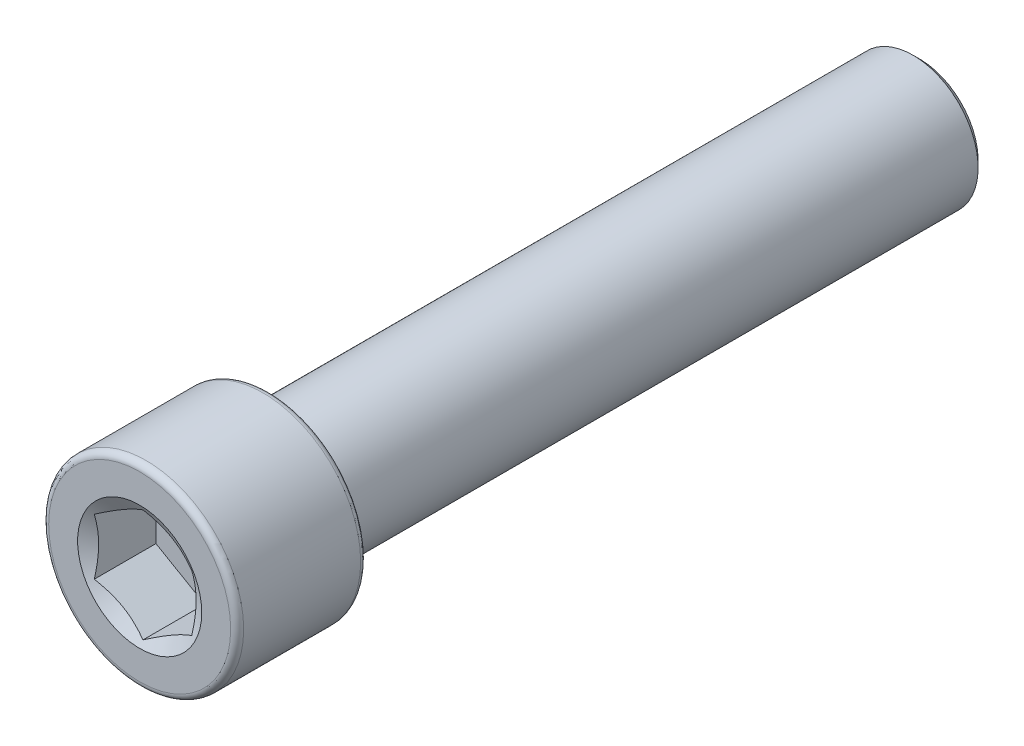
ISO-10303-21;
HEADER;
FILE_DESCRIPTION(('STEP AP214'),'2;1');
FILE_NAME('part.step','',(''),(''),'','','');
FILE_SCHEMA(('AUTOMOTIVE_DESIGN { 1 0 10303 214 1 1 1 1 }'));
ENDSEC;
DATA;
#1=APPLICATION_CONTEXT('core data for automotive mechanical design processes');
#2=APPLICATION_PROTOCOL_DEFINITION('international standard','automotive_design',2000,#1);
#3=PRODUCT_CONTEXT('',#1,'mechanical');
#4=PRODUCT('Part','Part','',(#3));
#5=PRODUCT_RELATED_PRODUCT_CATEGORY('part','',(#4));
#6=PRODUCT_DEFINITION_FORMATION('','',#4);
#7=PRODUCT_DEFINITION_CONTEXT('part definition',#1,'design');
#8=PRODUCT_DEFINITION('design','',#6,#7);
#9=PRODUCT_DEFINITION_SHAPE('','',#8);
#10=(LENGTH_UNIT() NAMED_UNIT(*) SI_UNIT(.MILLI.,.METRE.));
#11=(NAMED_UNIT(*) PLANE_ANGLE_UNIT() SI_UNIT($,.RADIAN.));
#12=(NAMED_UNIT(*) SI_UNIT($,.STERADIAN.) SOLID_ANGLE_UNIT());
#13=UNCERTAINTY_MEASURE_WITH_UNIT(LENGTH_MEASURE(1.E-05),#10,'distance_accuracy_value','');
#14=(GEOMETRIC_REPRESENTATION_CONTEXT(3) GLOBAL_UNCERTAINTY_ASSIGNED_CONTEXT((#13)) GLOBAL_UNIT_ASSIGNED_CONTEXT((#10,
#11,#12)) REPRESENTATION_CONTEXT('',''));
#15=CARTESIAN_POINT('',(0.,0.,0.));
#16=DIRECTION('',(0.,0.,1.));
#17=DIRECTION('',(1.,0.,0.));
#18=AXIS2_PLACEMENT_3D('',#15,#16,#17);
#19=CARTESIAN_POINT('',(0.,0.,-19.05));
#20=DIRECTION('',(0.,0.,-1.));
#21=DIRECTION('',(-1.,0.,0.));
#22=AXIS2_PLACEMENT_3D('',#19,#20,#21);
#23=PLANE('',#22);
#24=CARTESIAN_POINT('',(0.,0.,-19.05));
#25=DIRECTION('',(0.,0.,-1.));
#26=DIRECTION('',(-1.,0.,0.));
#27=AXIS2_PLACEMENT_3D('',#24,#25,#26);
#28=CIRCLE('',#27,2.85750000000001);
#29=CARTESIAN_POINT('',(-2.85750000000001,0.,-19.05));
#30=VERTEX_POINT('',#29);
#31=EDGE_CURVE('E49',#30,#30,#28,.T.);
#32=ORIENTED_EDGE('',*,*,#31,.T.);
#33=EDGE_LOOP('',(#32));
#34=FACE_BOUND('',#33,.T.);
#35=ADVANCED_FACE('F36',(#34),#23,.T.);
#36=CARTESIAN_POINT('',(0.,0.,-19.05));
#37=DIRECTION('',(0.,0.,1.));
#38=DIRECTION('',(1.,0.,0.));
#39=AXIS2_PLACEMENT_3D('',#36,#37,#38);
#40=CONICAL_SURFACE('',#39,2.85750000000001,0.785398163397451);
#41=CARTESIAN_POINT('',(0.,0.,-18.7325));
#42=DIRECTION('',(0.,0.,-1.));
#43=DIRECTION('',(-1.,0.,0.));
#44=AXIS2_PLACEMENT_3D('',#41,#42,#43);
#45=CIRCLE('',#44,3.17500000000001);
#46=CARTESIAN_POINT('',(-3.17500000000001,0.,-18.7325));
#47=VERTEX_POINT('',#46);
#48=EDGE_CURVE('E134',#47,#47,#45,.T.);
#49=ORIENTED_EDGE('',*,*,#48,.T.);
#50=EDGE_LOOP('',(#49));
#51=FACE_BOUND('',#50,.T.);
#52=ORIENTED_EDGE('',*,*,#31,.F.);
#53=EDGE_LOOP('',(#52));
#54=FACE_BOUND('',#53,.T.);
#55=ADVANCED_FACE('F140',(#51,#54),#40,.T.);
#56=CARTESIAN_POINT('',(0.,0.,-19.05));
#57=DIRECTION('',(0.,0.,-1.));
#58=DIRECTION('',(-1.,0.,0.));
#59=AXIS2_PLACEMENT_3D('',#56,#57,#58);
#60=CYLINDRICAL_SURFACE('',#59,3.17500000000001);
#61=CARTESIAN_POINT('',(0.,0.,12.7));
#62=DIRECTION('',(0.,0.,-1.));
#63=DIRECTION('',(-1.,0.,0.));
#64=AXIS2_PLACEMENT_3D('',#61,#62,#63);
#65=CIRCLE('',#64,3.175);
#66=CARTESIAN_POINT('',(-3.175,0.,12.7));
#67=VERTEX_POINT('',#66);
#68=EDGE_CURVE('E131',#67,#67,#65,.T.);
#69=ORIENTED_EDGE('',*,*,#68,.T.);
#70=EDGE_LOOP('',(#69));
#71=FACE_BOUND('',#70,.T.);
#72=ORIENTED_EDGE('',*,*,#48,.F.);
#73=EDGE_LOOP('',(#72));
#74=FACE_BOUND('',#73,.T.);
#75=ADVANCED_FACE('F142',(#71,#74),#60,.T.);
#76=CARTESIAN_POINT('',(0.,3.175,12.7));
#77=DIRECTION('',(0.,0.,-1.));
#78=DIRECTION('',(-1.,0.,0.));
#79=AXIS2_PLACEMENT_3D('',#76,#77,#78);
#80=PLANE('',#79);
#81=CARTESIAN_POINT('',(0.,0.,12.7));
#82=DIRECTION('',(0.,0.,-1.));
#83=DIRECTION('',(-1.,0.,0.));
#84=AXIS2_PLACEMENT_3D('',#81,#82,#83);
#85=CIRCLE('',#84,4.445);
#86=CARTESIAN_POINT('',(-4.445,0.,12.7));
#87=VERTEX_POINT('',#86);
#88=EDGE_CURVE('E128',#87,#87,#85,.T.);
#89=ORIENTED_EDGE('',*,*,#88,.T.);
#90=EDGE_LOOP('',(#89));
#91=FACE_BOUND('',#90,.T.);
#92=ORIENTED_EDGE('',*,*,#68,.F.);
#93=EDGE_LOOP('',(#92));
#94=FACE_BOUND('',#93,.T.);
#95=ADVANCED_FACE('F148',(#91,#94),#80,.T.);
#96=CARTESIAN_POINT('',(0.,0.,13.0175));
#97=DIRECTION('',(0.,0.,-1.));
#98=DIRECTION('',(-1.,0.,0.));
#99=AXIS2_PLACEMENT_3D('',#96,#97,#98);
#100=TOROIDAL_SURFACE('',#99,4.445,0.3175);
#101=CARTESIAN_POINT('',(0.,0.,13.0175));
#102=DIRECTION('',(0.,0.,-1.));
#103=DIRECTION('',(-1.,0.,0.));
#104=AXIS2_PLACEMENT_3D('',#101,#102,#103);
#105=CIRCLE('',#104,4.7625);
#106=CARTESIAN_POINT('',(-4.7625,0.,13.0175));
#107=VERTEX_POINT('',#106);
#108=EDGE_CURVE('E125',#107,#107,#105,.T.);
#109=ORIENTED_EDGE('',*,*,#108,.T.);
#110=EDGE_LOOP('',(#109));
#111=FACE_BOUND('',#110,.T.);
#112=ORIENTED_EDGE('',*,*,#88,.F.);
#113=EDGE_LOOP('',(#112));
#114=FACE_BOUND('',#113,.T.);
#115=ADVANCED_FACE('F154',(#111,#114),#100,.T.);
#116=CARTESIAN_POINT('',(0.,0.,-19.05));
#117=DIRECTION('',(0.,0.,-1.));
#118=DIRECTION('',(-1.,0.,0.));
#119=AXIS2_PLACEMENT_3D('',#116,#117,#118);
#120=CYLINDRICAL_SURFACE('',#119,4.7625);
#121=CARTESIAN_POINT('',(0.,0.,18.7325));
#122=DIRECTION('',(0.,0.,-1.));
#123=DIRECTION('',(-1.,0.,0.));
#124=AXIS2_PLACEMENT_3D('',#121,#122,#123);
#125=CIRCLE('',#124,4.7625);
#126=CARTESIAN_POINT('',(-4.7625,0.,18.7325));
#127=VERTEX_POINT('',#126);
#128=EDGE_CURVE('E122',#127,#127,#125,.T.);
#129=ORIENTED_EDGE('',*,*,#128,.T.);
#130=EDGE_LOOP('',(#129));
#131=FACE_BOUND('',#130,.T.);
#132=ORIENTED_EDGE('',*,*,#108,.F.);
#133=EDGE_LOOP('',(#132));
#134=FACE_BOUND('',#133,.T.);
#135=ADVANCED_FACE('F158',(#131,#134),#120,.T.);
#136=CARTESIAN_POINT('',(0.,0.,18.7325));
#137=DIRECTION('',(0.,0.,-1.));
#138=DIRECTION('',(-1.,0.,0.));
#139=AXIS2_PLACEMENT_3D('',#136,#137,#138);
#140=TOROIDAL_SURFACE('',#139,4.445,0.317499999999998);
#141=CARTESIAN_POINT('',(0.,0.,19.05));
#142=DIRECTION('',(0.,0.,-1.));
#143=DIRECTION('',(-1.,0.,0.));
#144=AXIS2_PLACEMENT_3D('',#141,#142,#143);
#145=CIRCLE('',#144,4.445);
#146=CARTESIAN_POINT('',(-4.445,0.,19.05));
#147=VERTEX_POINT('',#146);
#148=EDGE_CURVE('E119',#147,#147,#145,.T.);
#149=ORIENTED_EDGE('',*,*,#148,.T.);
#150=EDGE_LOOP('',(#149));
#151=FACE_BOUND('',#150,.T.);
#152=ORIENTED_EDGE('',*,*,#128,.F.);
#153=EDGE_LOOP('',(#152));
#154=FACE_BOUND('',#153,.T.);
#155=ADVANCED_FACE('F162',(#151,#154),#140,.T.);
#156=CARTESIAN_POINT('',(0.,4.44499999999999,19.05));
#157=DIRECTION('',(0.,0.,1.));
#158=DIRECTION('',(1.,0.,0.));
#159=AXIS2_PLACEMENT_3D('',#156,#157,#158);
#160=PLANE('',#159);
#161=CARTESIAN_POINT('',(0.,0.,19.05));
#162=DIRECTION('',(0.,0.,1.));
#163=DIRECTION('',(1.,0.,0.));
#164=AXIS2_PLACEMENT_3D('',#161,#162,#163);
#165=CIRCLE('',#164,3.03219221417966);
#166=CARTESIAN_POINT('',(3.03219221417966,0.,19.05));
#167=VERTEX_POINT('',#166);
#168=EDGE_CURVE('E256',#167,#167,#165,.T.);
#169=ORIENTED_EDGE('',*,*,#168,.F.);
#170=EDGE_LOOP('',(#169));
#171=FACE_BOUND('',#170,.T.);
#172=ORIENTED_EDGE('',*,*,#148,.F.);
#173=EDGE_LOOP('',(#172));
#174=FACE_BOUND('',#173,.T.);
#175=ADVANCED_FACE('F166',(#171,#174),#160,.T.);
#176=CARTESIAN_POINT('',(0.,0.,19.05));
#177=DIRECTION('',(0.,0.,1.));
#178=DIRECTION('',(1.,0.,0.));
#179=AXIS2_PLACEMENT_3D('',#176,#177,#178);
#180=CONICAL_SURFACE('',#179,3.03219221417966,1.0471975511966);
#181=ORIENTED_EDGE('',*,*,#168,.T.);
#182=EDGE_LOOP('',(#181));
#183=FACE_BOUND('',#182,.T.);
#184=CARTESIAN_POINT('',(2.38145,1.37469985845396,18.8869296797747));
#185=CARTESIAN_POINT('',(2.27680510857802,1.43511661468575,18.8520335875339));
#186=CARTESIAN_POINT('',(2.1712569313955,1.49605488319456,18.8202965816836));
#187=CARTESIAN_POINT('',(1.95833280582789,1.61898668440798,18.7648986717318));
#188=CARTESIAN_POINT('',(1.85095307338658,1.68098240183848,18.7412573664923));
#189=CARTESIAN_POINT('',(1.63752441306378,1.80420549632863,18.7044553443056));
#190=CARTESIAN_POINT('',(1.53150832846243,1.86541391131165,18.6910497054727));
#191=CARTESIAN_POINT('',(1.31897718209788,1.9881188258764,18.6750446234132));
#192=CARTESIAN_POINT('',(1.21246289310218,2.04961487930061,18.6724319282234));
#193=CARTESIAN_POINT('',(1.01342600969027,2.16452887751714,18.6778600893659));
#194=CARTESIAN_POINT('',(0.920873657438136,2.21796400300405,18.6845681458576));
#195=CARTESIAN_POINT('',(0.736371946153153,2.32448611568038,18.7058309696216));
#196=CARTESIAN_POINT('',(0.644423225529253,2.37757273428423,18.7203930040322));
#197=CARTESIAN_POINT('',(0.459540942889936,2.48431456993443,18.7567978377253));
#198=CARTESIAN_POINT('',(0.366630787034621,2.53795627342795,18.7787949938814));
#199=CARTESIAN_POINT('',(0.182196405744562,2.64443951311358,18.8287202236105));
#200=CARTESIAN_POINT('',(0.0906698164537946,2.69728241407862,18.8566365624169));
#201=CARTESIAN_POINT('',(-0.000200000000000065,2.74974612706943,18.8869296797747));
#202=B_SPLINE_CURVE_WITH_KNOTS('',3,(#184,#185,#186,#187,#188,#189,#190,#191,#192,#193,#194,
#195,#196,#197,#198,#199,#200,#201),.UNSPECIFIED.,.F.,.F.,(4,2,2,2,2,2,2,2,4),(0.,
0.37746300172044,0.755833447356087,1.1248388545394,1.49339104874266,1.81432726847353,
2.1355609551887,2.4639212191382,2.79163649648301),.UNSPECIFIED.);
#203=CARTESIAN_POINT('',(2.38125,1.37481532850779,18.8868630089087));
#204=VERTEX_POINT('',#203);
#205=CARTESIAN_POINT('',(0.,2.74963065701559,18.8868630089087));
#206=VERTEX_POINT('',#205);
#207=EDGE_CURVE('E103',#204,#206,#202,.T.);
#208=ORIENTED_EDGE('',*,*,#207,.F.);
#209=CARTESIAN_POINT('',(2.38125,-3.59976633824538,19.7912611644295));
#210=CARTESIAN_POINT('',(2.38125,-3.49646395881337,19.7415324836855));
#211=CARTESIAN_POINT('',(2.38125,-3.39291407009265,19.6923085892494));
#212=CARTESIAN_POINT('',(2.38125,-3.18518717181846,19.5951564977165));
#213=CARTESIAN_POINT('',(2.38125,-3.08101005703532,19.5472285258866));
#214=CARTESIAN_POINT('',(2.38125,-2.87131401421193,19.4526930902144));
#215=CARTESIAN_POINT('',(2.38125,-2.76579079437246,19.4060951113206));
#216=CARTESIAN_POINT('',(2.38125,-2.55387118203947,19.3149364827971));
#217=CARTESIAN_POINT('',(2.38125,-2.44747483422772,19.2703757296712));
#218=CARTESIAN_POINT('',(2.38125,-2.2306719684591,19.182631851781));
#219=CARTESIAN_POINT('',(2.38125,-2.12023600195454,19.1395210708127));
#220=CARTESIAN_POINT('',(2.38125,-1.89803839134693,19.0567937390092));
#221=CARTESIAN_POINT('',(2.38125,-1.78627659559217,19.0171775923576));
#222=CARTESIAN_POINT('',(2.38125,-1.56149041735539,18.9425477895721));
#223=CARTESIAN_POINT('',(2.38125,-1.44846944761671,18.9075239630361));
#224=CARTESIAN_POINT('',(2.38125,-1.22081073511454,18.8432629117452));
#225=CARTESIAN_POINT('',(2.38125,-1.10617354309387,18.8140237645329));
#226=CARTESIAN_POINT('',(2.38125,-0.875790756878795,18.7629337388859));
#227=CARTESIAN_POINT('',(2.38125,-0.760052762621305,18.7410492449066));
#228=CARTESIAN_POINT('',(2.38125,-0.527241538813738,18.7059822843521));
#229=CARTESIAN_POINT('',(2.38125,-0.410168413785967,18.6927991412743));
#230=CARTESIAN_POINT('',(2.38125,-0.176757909156527,18.6763592365983));
#231=CARTESIAN_POINT('',(2.38125,-0.0604292020566072,18.6729823294229));
#232=CARTESIAN_POINT('',(2.38125,0.172102526495441,18.6761301571011));
#233=CARTESIAN_POINT('',(2.38125,0.288305540624635,18.6826554407246));
#234=CARTESIAN_POINT('',(2.38125,0.488407104907266,18.7019728989663));
#235=CARTESIAN_POINT('',(2.38125,0.572526768128162,18.7125877365416));
#236=CARTESIAN_POINT('',(2.38125,0.740085928751665,18.7382929254538));
#237=CARTESIAN_POINT('',(2.38125,0.823525319662306,18.7533839641938));
#238=CARTESIAN_POINT('',(2.38125,1.07273325586548,18.80457343129));
#239=CARTESIAN_POINT('',(2.38125,1.23729002677747,18.8465771837148));
#240=CARTESIAN_POINT('',(2.38125,1.56668315583936,18.9429511253518));
#241=CARTESIAN_POINT('',(2.38125,1.7314405282236,18.9975811694067));
#242=CARTESIAN_POINT('',(2.38125,1.97631292230749,19.0856187750601));
#243=CARTESIAN_POINT('',(2.38125,2.05754928439703,19.1159756920629));
#244=CARTESIAN_POINT('',(2.38125,2.2193629714156,19.1783957224258));
#245=CARTESIAN_POINT('',(2.38125,2.29994030817707,19.2104588050747));
#246=CARTESIAN_POINT('',(2.38125,2.50911202812042,19.2958324530248));
#247=CARTESIAN_POINT('',(2.38125,2.63725060996073,19.35025731756));
#248=CARTESIAN_POINT('',(2.38125,2.89233256605394,19.4618480388214));
#249=CARTESIAN_POINT('',(2.38125,3.01927584315841,19.5190141160782));
#250=CARTESIAN_POINT('',(2.38125,3.27222855247941,19.6354567661809));
#251=CARTESIAN_POINT('',(2.38125,3.39823772867165,19.6947338935472));
#252=CARTESIAN_POINT('',(2.38125,3.64947609912468,19.8149213116136));
#253=CARTESIAN_POINT('',(2.38125,3.7747052747107,19.8758316412321));
#254=CARTESIAN_POINT('',(2.38125,4.14976436460614,20.0606293734581));
#255=CARTESIAN_POINT('',(2.38125,4.39864815512716,20.1864349728279));
#256=CARTESIAN_POINT('',(2.38125,4.8946762561178,20.4413121050035));
#257=CARTESIAN_POINT('',(2.38125,5.14182083564058,20.5703831177985));
#258=CARTESIAN_POINT('',(2.38125,5.61084172457361,20.818066970761));
#259=CARTESIAN_POINT('',(2.38125,5.83282885020021,20.9364703062649));
#260=CARTESIAN_POINT('',(2.38125,6.27608857926107,21.1746296719868));
#261=CARTESIAN_POINT('',(2.38125,6.4973611487004,21.2943857653776));
#262=CARTESIAN_POINT('',(2.38125,6.93875603869061,21.5345822776973));
#263=CARTESIAN_POINT('',(2.38125,7.15887985119658,21.6550199580106));
#264=CARTESIAN_POINT('',(2.38125,7.59868091402186,21.896675883145));
#265=CARTESIAN_POINT('',(2.38125,7.81835819130606,22.0178940788725));
#266=CARTESIAN_POINT('',(2.38125,8.03787642276091,22.1393977522439));
#267=B_SPLINE_CURVE_WITH_KNOTS('',3,(#209,#210,#211,#212,#213,#214,#215,#216,#217,#218,#219,
#220,#221,#222,#223,#224,#225,#226,#227,#228,#229,#230,#231,#232,#233,#234,#235,#236,#237,#238,
#239,#240,#241,#242,#243,#244,#245,#246,#247,#248,#249,#250,#251,#252,#253,#254,#255,#256,#257,
#258,#259,#260,#261,#262,#263,#264,#265,#266),.UNSPECIFIED.,.F.,.F.,(4,2,2,2,2,2,2,2,2,2,2,2,2,
2,2,2,2,2,2,2,2,2,2,2,2,2,2,2,4),(0.,0.343950780921492,0.687960970461106,1.0340054839437,
1.38003239789182,1.73564357991987,2.09129583755096,2.44614664320017,2.80087932031082,
3.15396785782399,3.50702894058495,3.85574569670582,4.20448177908075,4.45871798756719,
4.71299325893,5.22184880640701,5.74229337432346,6.00244751925216,6.26259698295642,
6.68020411231574,7.09784489471861,7.51559620207542,7.93335747307524,8.76993188334098,
9.60637389902895,10.3611381643167,11.1159378234818,11.8686893766334,12.6213940361872),.UNSPECIFIED.);
#268=CARTESIAN_POINT('',(2.38125,-1.37481532850779,18.8868630089087));
#269=VERTEX_POINT('',#268);
#270=EDGE_CURVE('E212',#269,#204,#267,.T.);
#271=ORIENTED_EDGE('',*,*,#270,.F.);
#272=CARTESIAN_POINT('',(-0.000200000000001083,-2.74974612706943,18.8869296797747));
#273=CARTESIAN_POINT('',(0.104444891421974,-2.68932937083763,18.8520335875339));
#274=CARTESIAN_POINT('',(0.209993068604494,-2.62839110232883,18.8202965816836));
#275=CARTESIAN_POINT('',(0.422917194172109,-2.5054593011154,18.7648986717318));
#276=CARTESIAN_POINT('',(0.530296926613417,-2.4434635836849,18.7412573664923));
#277=CARTESIAN_POINT('',(0.743725586936212,-2.32024048919475,18.7044553443056));
#278=CARTESIAN_POINT('',(0.849741671537565,-2.25903207421173,18.6910497054727));
#279=CARTESIAN_POINT('',(1.06227281790212,-2.13632715964698,18.6750446234132));
#280=CARTESIAN_POINT('',(1.16878710689781,-2.07483110622277,18.6724319282234));
#281=CARTESIAN_POINT('',(1.36782399030972,-1.95991710800624,18.6778600893659));
#282=CARTESIAN_POINT('',(1.46037634256186,-1.90648198251934,18.6845681458576));
#283=CARTESIAN_POINT('',(1.64487805384684,-1.79995986984301,18.7058309696216));
#284=CARTESIAN_POINT('',(1.73682677447074,-1.74687325123916,18.7203930040322));
#285=CARTESIAN_POINT('',(1.92170905711006,-1.64013141558895,18.7567978377253));
#286=CARTESIAN_POINT('',(2.01461921296537,-1.58648971209544,18.7787949938814));
#287=CARTESIAN_POINT('',(2.19905359425543,-1.4800064724098,18.8287202236105));
#288=CARTESIAN_POINT('',(2.2905801835462,-1.42716357144477,18.8566365624169));
#289=CARTESIAN_POINT('',(2.38145,-1.37469985845396,18.8869296797747));
#290=B_SPLINE_CURVE_WITH_KNOTS('',3,(#272,#273,#274,#275,#276,#277,#278,#279,#280,#281,#282,
#283,#284,#285,#286,#287,#288,#289),.UNSPECIFIED.,.F.,.F.,(4,2,2,2,2,2,2,2,4),(0.,
0.377463001720441,0.755833447356087,1.1248388545394,1.49339104874266,1.81432726847353,
2.1355609551887,2.4639212191382,2.79163649648301),.UNSPECIFIED.);
#291=CARTESIAN_POINT('',(0.,-2.74963065701559,18.8868630089087));
#292=VERTEX_POINT('',#291);
#293=EDGE_CURVE('E206',#292,#269,#290,.T.);
#294=ORIENTED_EDGE('',*,*,#293,.F.);
#295=CARTESIAN_POINT('',(-2.38145,-1.37469985845396,18.8869296797747));
#296=CARTESIAN_POINT('',(-2.27680510857802,-1.43511661468575,18.8520335875339));
#297=CARTESIAN_POINT('',(-2.1712569313955,-1.49605488319456,18.8202965816836));
#298=CARTESIAN_POINT('',(-1.95833280582789,-1.61898668440798,18.7648986717318));
#299=CARTESIAN_POINT('',(-1.85095307338658,-1.68098240183848,18.7412573664923));
#300=CARTESIAN_POINT('',(-1.63752441306378,-1.80420549632863,18.7044553443056));
#301=CARTESIAN_POINT('',(-1.53150832846243,-1.86541391131165,18.6910497054727));
#302=CARTESIAN_POINT('',(-1.31897718209788,-1.9881188258764,18.6750446234132));
#303=CARTESIAN_POINT('',(-1.21246289310218,-2.04961487930061,18.6724319282234));
#304=CARTESIAN_POINT('',(-1.01342600969027,-2.16452887751714,18.6778600893659));
#305=CARTESIAN_POINT('',(-0.920873657438135,-2.21796400300405,18.6845681458576));
#306=CARTESIAN_POINT('',(-0.736371946153153,-2.32448611568038,18.7058309696216));
#307=CARTESIAN_POINT('',(-0.644423225529253,-2.37757273428423,18.7203930040322));
#308=CARTESIAN_POINT('',(-0.459540942889937,-2.48431456993443,18.7567978377253));
#309=CARTESIAN_POINT('',(-0.366630787034622,-2.53795627342795,18.7787949938814));
#310=CARTESIAN_POINT('',(-0.182196405744563,-2.64443951311358,18.8287202236105));
#311=CARTESIAN_POINT('',(-0.0906698164537958,-2.69728241407862,18.8566365624169));
#312=CARTESIAN_POINT('',(0.000199999999998713,-2.74974612706943,18.8869296797747));
#313=B_SPLINE_CURVE_WITH_KNOTS('',3,(#295,#296,#297,#298,#299,#300,#301,#302,#303,#304,#305,
#306,#307,#308,#309,#310,#311,#312),.UNSPECIFIED.,.F.,.F.,(4,2,2,2,2,2,2,2,4),(0.,
0.37746300172044,0.755833447356087,1.1248388545394,1.49339104874266,1.81432726847353,
2.1355609551887,2.4639212191382,2.791636496483),.UNSPECIFIED.);
#314=CARTESIAN_POINT('',(-2.38125,-1.3748153285078,18.8868630089087));
#315=VERTEX_POINT('',#314);
#316=EDGE_CURVE('E56',#315,#292,#313,.T.);
#317=ORIENTED_EDGE('',*,*,#316,.F.);
#318=CARTESIAN_POINT('',(-2.38125,-3.59976633839616,19.7912611645021));
#319=CARTESIAN_POINT('',(-2.38125,-3.49646395895909,19.7415324837551));
#320=CARTESIAN_POINT('',(-2.38125,-3.39291407023331,19.6923085893159));
#321=CARTESIAN_POINT('',(-2.38125,-3.18518717194898,19.5951564977768));
#322=CARTESIAN_POINT('',(-2.38125,-3.08101005716077,19.5472285259438));
#323=CARTESIAN_POINT('',(-2.38125,-2.87131401432712,19.4526930902656));
#324=CARTESIAN_POINT('',(-2.38125,-2.76579079448248,19.4060951113687));
#325=CARTESIAN_POINT('',(-2.38125,-2.55387118213911,19.3149364828392));
#326=CARTESIAN_POINT('',(-2.38125,-2.44747483432216,19.2703757297102));
#327=CARTESIAN_POINT('',(-2.38125,-2.23067196854283,19.182631851814));
#328=CARTESIAN_POINT('',(-2.38125,-2.12023600203275,19.1395210708426));
#329=CARTESIAN_POINT('',(-2.38125,-1.89803839141401,19.0567937390333));
#330=CARTESIAN_POINT('',(-2.38125,-1.78627659565365,19.0171775923788));
#331=CARTESIAN_POINT('',(-2.38125,-1.56149041740554,18.9425477895879));
#332=CARTESIAN_POINT('',(-2.38125,-1.44846944766115,18.9075239630494));
#333=CARTESIAN_POINT('',(-2.38125,-1.22081073514739,18.8432629117537));
#334=CARTESIAN_POINT('',(-2.38125,-1.10617354312085,18.8140237645394));
#335=CARTESIAN_POINT('',(-2.38125,-0.875790756890796,18.7629337388881));
#336=CARTESIAN_POINT('',(-2.38125,-0.760052762624165,18.7410492449069));
#337=CARTESIAN_POINT('',(-2.38125,-0.527241538798119,18.7059822843499));
#338=CARTESIAN_POINT('',(-2.38125,-0.41016841376101,18.6927991412715));
#339=CARTESIAN_POINT('',(-2.38125,-0.176757909113056,18.6763592365962));
#340=CARTESIAN_POINT('',(-2.38125,-0.0604292020039625,18.6729823294219));
#341=CARTESIAN_POINT('',(-2.38125,0.172102526566268,18.6761301571038));
#342=CARTESIAN_POINT('',(-2.38125,0.28830554070447,18.6826554407299));
#343=CARTESIAN_POINT('',(-2.38125,0.488407104998753,18.7019728989769));
#344=CARTESIAN_POINT('',(-2.38125,0.57252676822239,18.7125877365543));
#345=CARTESIAN_POINT('',(-2.38125,0.740085928851263,18.7382929254708));
#346=CARTESIAN_POINT('',(-2.38125,0.823525319764533,18.7533839642131));
#347=CARTESIAN_POINT('',(-2.38125,1.07273325597547,18.8045734313161));
#348=CARTESIAN_POINT('',(-2.38125,1.23729002689245,18.8465771837454));
#349=CARTESIAN_POINT('',(-2.38125,1.56668315596439,18.9429511253914));
#350=CARTESIAN_POINT('',(-2.38125,1.73144052835367,18.9975811694509));
#351=CARTESIAN_POINT('',(-2.38125,1.9763129224451,19.0856187751109));
#352=CARTESIAN_POINT('',(-2.38125,2.05754928453714,19.1159756921158));
#353=CARTESIAN_POINT('',(-2.38125,2.21936297156072,19.178395722483));
#354=CARTESIAN_POINT('',(-2.38125,2.29994030832469,19.2104588051339));
#355=CARTESIAN_POINT('',(-2.38125,2.50911202826963,19.2958324530874));
#356=CARTESIAN_POINT('',(-2.38125,2.63725061010911,19.3502573176237));
#357=CARTESIAN_POINT('',(-2.38125,2.89233256620074,19.4618480388869));
#358=CARTESIAN_POINT('',(-2.38125,3.01927584330447,19.5190141161445));
#359=CARTESIAN_POINT('',(-2.38125,3.27222855262407,19.6354567662485));
#360=CARTESIAN_POINT('',(-2.38125,3.39823772881566,19.6947338936153));
#361=CARTESIAN_POINT('',(-2.38125,3.64947609926743,19.8149213116827));
#362=CARTESIAN_POINT('',(-2.38125,3.77470527485286,19.8758316413015));
#363=CARTESIAN_POINT('',(-2.38125,4.14976436474655,20.0606293735285));
#364=CARTESIAN_POINT('',(-2.38125,4.39864815526649,20.1864349728987));
#365=CARTESIAN_POINT('',(-2.38125,4.89467625625509,20.4413121050749));
#366=CARTESIAN_POINT('',(-2.38125,5.14182083577691,20.57038311787));
#367=CARTESIAN_POINT('',(-2.38125,5.61084172470908,20.818066970833));
#368=CARTESIAN_POINT('',(-2.38124999999999,5.83282885033576,20.9364703063374));
#369=CARTESIAN_POINT('',(-2.38124999999999,6.27608857939681,21.1746296720601));
#370=CARTESIAN_POINT('',(-2.38124999999999,6.49736114883626,21.2943857654512));
#371=CARTESIAN_POINT('',(-2.38124999999999,6.93875603882683,21.5345822777717));
#372=CARTESIAN_POINT('',(-2.38124999999999,7.15887985133306,21.6550199580854));
#373=CARTESIAN_POINT('',(-2.38124999999999,7.59868091415888,21.8966758832205));
#374=CARTESIAN_POINT('',(-2.38124999999999,7.81835819144335,22.0178940789483));
#375=CARTESIAN_POINT('',(-2.38124999999999,8.03787642289848,22.13939775232));
#376=B_SPLINE_CURVE_WITH_KNOTS('',3,(#318,#319,#320,#321,#322,#323,#324,#325,#326,#327,#328,
#329,#330,#331,#332,#333,#334,#335,#336,#337,#338,#339,#340,#341,#342,#343,#344,#345,#346,#347,
#348,#349,#350,#351,#352,#353,#354,#355,#356,#357,#358,#359,#360,#361,#362,#363,#364,#365,#366,
#367,#368,#369,#370,#371,#372,#373,#374,#375),.UNSPECIFIED.,.F.,.F.,(4,2,2,2,2,2,2,2,2,2,2,2,2,
2,2,2,2,2,2,2,2,2,2,2,2,2,2,2,4),(0.,0.343950780939163,0.687960970496452,1.03400548399693,
1.38003239796295,1.73564358000971,2.09129583765952,2.44614664332737,2.80087932045665,
3.15396785799778,3.50702894078666,3.85574569693484,4.20448177933711,4.4587179878325,
4.71299325920427,5.2218488066992,5.74229337463429,6.00244751957228,6.26259698328584,
6.68020411264411,7.09784489504591,7.51559620240164,7.93335747340037,8.76993188366374,
9.60637389934937,10.361138164638,11.1159378238039,11.8686893769567,12.6213940365117),.UNSPECIFIED.);
#377=CARTESIAN_POINT('',(-2.38125,1.37481532850779,18.8868630089087));
#378=VERTEX_POINT('',#377);
#379=EDGE_CURVE('E11',#378,#315,#376,.F.);
#380=ORIENTED_EDGE('',*,*,#379,.F.);
#381=CARTESIAN_POINT('',(0.000200000000000154,2.74974612706943,18.8869296797747));
#382=CARTESIAN_POINT('',(-0.104444891421976,2.68932937083763,18.8520335875339));
#383=CARTESIAN_POINT('',(-0.209993068604496,2.62839110232883,18.8202965816836));
#384=CARTESIAN_POINT('',(-0.422917194172111,2.5054593011154,18.7648986717318));
#385=CARTESIAN_POINT('',(-0.530296926613419,2.4434635836849,18.7412573664923));
#386=CARTESIAN_POINT('',(-0.743725586936214,2.32024048919475,18.7044553443056));
#387=CARTESIAN_POINT('',(-0.849741671537567,2.25903207421173,18.6910497054727));
#388=CARTESIAN_POINT('',(-1.06227281790212,2.13632715964698,18.6750446234132));
#389=CARTESIAN_POINT('',(-1.16878710689781,2.07483110622277,18.6724319282234));
#390=CARTESIAN_POINT('',(-1.36782399030972,1.95991710800624,18.6778600893659));
#391=CARTESIAN_POINT('',(-1.46037634256186,1.90648198251934,18.6845681458576));
#392=CARTESIAN_POINT('',(-1.64487805384684,1.79995986984301,18.7058309696216));
#393=CARTESIAN_POINT('',(-1.73682677447074,1.74687325123916,18.7203930040322));
#394=CARTESIAN_POINT('',(-1.92170905711006,1.64013141558895,18.7567978377253));
#395=CARTESIAN_POINT('',(-2.01461921296538,1.58648971209544,18.7787949938814));
#396=CARTESIAN_POINT('',(-2.19905359425543,1.4800064724098,18.8287202236105));
#397=CARTESIAN_POINT('',(-2.2905801835462,1.42716357144477,18.8566365624169));
#398=CARTESIAN_POINT('',(-2.38145,1.37469985845396,18.8869296797747));
#399=B_SPLINE_CURVE_WITH_KNOTS('',3,(#381,#382,#383,#384,#385,#386,#387,#388,#389,#390,#391,
#392,#393,#394,#395,#396,#397,#398),.UNSPECIFIED.,.F.,.F.,(4,2,2,2,2,2,2,2,4),(0.,
0.377463001720441,0.755833447356087,1.1248388545394,1.49339104874266,1.81432726847353,
2.1355609551887,2.4639212191382,2.791636496483),.UNSPECIFIED.);
#400=EDGE_CURVE('E94',#206,#378,#399,.T.);
#401=ORIENTED_EDGE('',*,*,#400,.F.);
#402=EDGE_LOOP('',(#208,#271,#294,#317,#380,#401));
#403=FACE_BOUND('',#402,.T.);
#404=ADVANCED_FACE('F93',(#183,#403),#180,.F.);
#405=CARTESIAN_POINT('',(0.,0.,15.875));
#406=DIRECTION('',(0.,0.,1.));
#407=DIRECTION('',(1.,0.,0.));
#408=AXIS2_PLACEMENT_3D('',#405,#406,#407);
#409=PLANE('',#408);
#410=DIRECTION('',(-0.866025403784439,-0.5,0.));
#411=VECTOR('',#410,1.);
#412=CARTESIAN_POINT('',(0.,2.74963065701559,15.875));
#413=LINE('',#412,#411);
#414=CARTESIAN_POINT('',(0.,2.74963065701559,15.875));
#415=VERTEX_POINT('',#414);
#416=CARTESIAN_POINT('',(-2.38125,1.37481532850779,15.875));
#417=VERTEX_POINT('',#416);
#418=EDGE_CURVE('E102',#415,#417,#413,.T.);
#419=ORIENTED_EDGE('',*,*,#418,.T.);
#420=DIRECTION('',(0.,-1.,0.));
#421=VECTOR('',#420,1.);
#422=CARTESIAN_POINT('',(-2.38125,1.37481532850779,15.875));
#423=LINE('',#422,#421);
#424=CARTESIAN_POINT('',(-2.38125,-1.3748153285078,15.875));
#425=VERTEX_POINT('',#424);
#426=EDGE_CURVE('E107',#417,#425,#423,.T.);
#427=ORIENTED_EDGE('',*,*,#426,.T.);
#428=DIRECTION('',(0.866025403784439,-0.5,0.));
#429=VECTOR('',#428,1.);
#430=CARTESIAN_POINT('',(-2.38125,-1.3748153285078,15.875));
#431=LINE('',#430,#429);
#432=CARTESIAN_POINT('',(0.,-2.74963065701559,15.875));
#433=VERTEX_POINT('',#432);
#434=EDGE_CURVE('E238',#425,#433,#431,.T.);
#435=ORIENTED_EDGE('',*,*,#434,.T.);
#436=DIRECTION('',(0.866025403784439,0.5,0.));
#437=VECTOR('',#436,1.);
#438=CARTESIAN_POINT('',(0.,-2.74963065701559,15.875));
#439=LINE('',#438,#437);
#440=CARTESIAN_POINT('',(2.38125,-1.37481532850779,15.875));
#441=VERTEX_POINT('',#440);
#442=EDGE_CURVE('E242',#433,#441,#439,.T.);
#443=ORIENTED_EDGE('',*,*,#442,.T.);
#444=DIRECTION('',(0.,1.,0.));
#445=VECTOR('',#444,1.);
#446=CARTESIAN_POINT('',(2.38125,-1.37481532850779,15.875));
#447=LINE('',#446,#445);
#448=CARTESIAN_POINT('',(2.38125,1.37481532850779,15.875));
#449=VERTEX_POINT('',#448);
#450=EDGE_CURVE('E115',#441,#449,#447,.T.);
#451=ORIENTED_EDGE('',*,*,#450,.T.);
#452=DIRECTION('',(-0.866025403784438,0.5,0.));
#453=VECTOR('',#452,1.);
#454=CARTESIAN_POINT('',(2.38125,1.37481532850779,15.875));
#455=LINE('',#454,#453);
#456=EDGE_CURVE('E110',#449,#415,#455,.T.);
#457=ORIENTED_EDGE('',*,*,#456,.T.);
#458=EDGE_LOOP('',(#419,#427,#435,#443,#451,#457));
#459=FACE_BOUND('',#458,.T.);
#460=ADVANCED_FACE('F192',(#459),#409,.T.);
#461=CARTESIAN_POINT('',(-2.38125,1.37481532850779,15.875));
#462=DIRECTION('',(-1.,0.,0.));
#463=DIRECTION('',(0.,-1.,0.));
#464=AXIS2_PLACEMENT_3D('',#461,#462,#463);
#465=PLANE('',#464);
#466=DIRECTION('',(0.,0.,1.));
#467=VECTOR('',#466,1.);
#468=CARTESIAN_POINT('',(-2.38125,1.37481532850779,15.875));
#469=LINE('',#468,#467);
#470=EDGE_CURVE('E100',#417,#378,#469,.T.);
#471=ORIENTED_EDGE('',*,*,#470,.T.);
#472=ORIENTED_EDGE('',*,*,#379,.T.);
#473=DIRECTION('',(0.,0.,1.));
#474=VECTOR('',#473,1.);
#475=CARTESIAN_POINT('',(-2.38125,-1.3748153285078,15.875));
#476=LINE('',#475,#474);
#477=EDGE_CURVE('E109',#425,#315,#476,.T.);
#478=ORIENTED_EDGE('',*,*,#477,.F.);
#479=ORIENTED_EDGE('',*,*,#426,.F.);
#480=EDGE_LOOP('',(#471,#472,#478,#479));
#481=FACE_BOUND('',#480,.T.);
#482=ADVANCED_FACE('F105',(#481),#465,.F.);
#483=CARTESIAN_POINT('',(-2.38125,-1.3748153285078,15.875));
#484=DIRECTION('',(-0.5,-0.866025403784439,0.));
#485=DIRECTION('',(0.866025403784439,-0.5,0.));
#486=AXIS2_PLACEMENT_3D('',#483,#484,#485);
#487=PLANE('',#486);
#488=ORIENTED_EDGE('',*,*,#477,.T.);
#489=ORIENTED_EDGE('',*,*,#316,.T.);
#490=DIRECTION('',(0.,0.,1.));
#491=VECTOR('',#490,1.);
#492=CARTESIAN_POINT('',(0.,-2.74963065701559,15.875));
#493=LINE('',#492,#491);
#494=EDGE_CURVE('E112',#433,#292,#493,.T.);
#495=ORIENTED_EDGE('',*,*,#494,.F.);
#496=ORIENTED_EDGE('',*,*,#434,.F.);
#497=EDGE_LOOP('',(#488,#489,#495,#496));
#498=FACE_BOUND('',#497,.T.);
#499=ADVANCED_FACE('F227',(#498),#487,.F.);
#500=CARTESIAN_POINT('',(0.,-2.74963065701559,15.875));
#501=DIRECTION('',(0.5,-0.866025403784439,0.));
#502=DIRECTION('',(0.866025403784439,0.5,0.));
#503=AXIS2_PLACEMENT_3D('',#500,#501,#502);
#504=PLANE('',#503);
#505=ORIENTED_EDGE('',*,*,#494,.T.);
#506=ORIENTED_EDGE('',*,*,#293,.T.);
#507=DIRECTION('',(0.,0.,1.));
#508=VECTOR('',#507,1.);
#509=CARTESIAN_POINT('',(2.38125,-1.37481532850779,15.875));
#510=LINE('',#509,#508);
#511=EDGE_CURVE('E252',#441,#269,#510,.T.);
#512=ORIENTED_EDGE('',*,*,#511,.F.);
#513=ORIENTED_EDGE('',*,*,#442,.F.);
#514=EDGE_LOOP('',(#505,#506,#512,#513));
#515=FACE_BOUND('',#514,.T.);
#516=ADVANCED_FACE('F222',(#515),#504,.F.);
#517=CARTESIAN_POINT('',(2.38125,-1.37481532850779,15.875));
#518=DIRECTION('',(1.,0.,0.));
#519=DIRECTION('',(0.,0.,-1.));
#520=AXIS2_PLACEMENT_3D('',#517,#518,#519);
#521=PLANE('',#520);
#522=ORIENTED_EDGE('',*,*,#511,.T.);
#523=ORIENTED_EDGE('',*,*,#270,.T.);
#524=DIRECTION('',(0.,0.,1.));
#525=VECTOR('',#524,1.);
#526=CARTESIAN_POINT('',(2.38125,1.37481532850779,15.875));
#527=LINE('',#526,#525);
#528=EDGE_CURVE('E249',#449,#204,#527,.T.);
#529=ORIENTED_EDGE('',*,*,#528,.F.);
#530=ORIENTED_EDGE('',*,*,#450,.F.);
#531=EDGE_LOOP('',(#522,#523,#529,#530));
#532=FACE_BOUND('',#531,.T.);
#533=ADVANCED_FACE('F219',(#532),#521,.F.);
#534=CARTESIAN_POINT('',(2.38125,1.37481532850779,15.875));
#535=DIRECTION('',(0.5,0.866025403784438,0.));
#536=DIRECTION('',(-0.866025403784439,0.5,0.));
#537=AXIS2_PLACEMENT_3D('',#534,#535,#536);
#538=PLANE('',#537);
#539=ORIENTED_EDGE('',*,*,#528,.T.);
#540=ORIENTED_EDGE('',*,*,#207,.T.);
#541=DIRECTION('',(0.,0.,1.));
#542=VECTOR('',#541,1.);
#543=CARTESIAN_POINT('',(0.,2.74963065701559,15.875));
#544=LINE('',#543,#542);
#545=EDGE_CURVE('E63',#415,#206,#544,.T.);
#546=ORIENTED_EDGE('',*,*,#545,.F.);
#547=ORIENTED_EDGE('',*,*,#456,.F.);
#548=EDGE_LOOP('',(#539,#540,#546,#547));
#549=FACE_BOUND('',#548,.T.);
#550=ADVANCED_FACE('F173',(#549),#538,.F.);
#551=CARTESIAN_POINT('',(0.,2.74963065701559,15.875));
#552=DIRECTION('',(-0.5,0.866025403784439,0.));
#553=DIRECTION('',(-0.866025403784439,-0.5,0.));
#554=AXIS2_PLACEMENT_3D('',#551,#552,#553);
#555=PLANE('',#554);
#556=ORIENTED_EDGE('',*,*,#545,.T.);
#557=ORIENTED_EDGE('',*,*,#400,.T.);
#558=ORIENTED_EDGE('',*,*,#470,.F.);
#559=ORIENTED_EDGE('',*,*,#418,.F.);
#560=EDGE_LOOP('',(#556,#557,#558,#559));
#561=FACE_BOUND('',#560,.T.);
#562=ADVANCED_FACE('F99',(#561),#555,.F.);
#563=CLOSED_SHELL('',(#35,#55,#75,#95,#115,#135,#155,#175,#404,#460,#482,#499,#516,#533,#550,#562));
#564=MANIFOLD_SOLID_BREP('B2',#563);
#565=ADVANCED_BREP_SHAPE_REPRESENTATION('',(#18,#564),#14);
#566=SHAPE_DEFINITION_REPRESENTATION(#9,#565);
ENDSEC;
END-ISO-10303-21;
